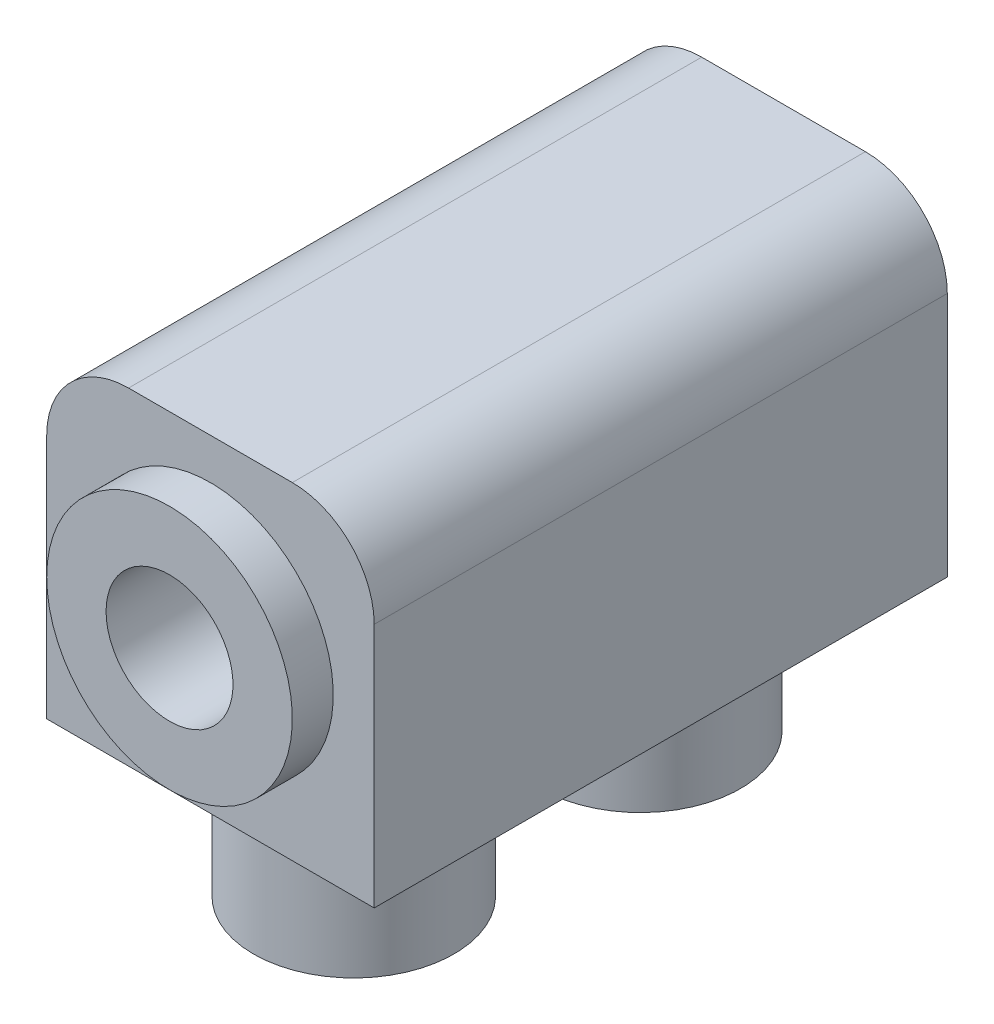
ISO-10303-21;
HEADER;
FILE_DESCRIPTION(('STEP AP214'),'2;1');
FILE_NAME('part.step','',(''),(''),'','','');
FILE_SCHEMA(('AUTOMOTIVE_DESIGN { 1 0 10303 214 1 1 1 1 }'));
ENDSEC;
DATA;
#1=APPLICATION_CONTEXT('core data for automotive mechanical design processes');
#2=APPLICATION_PROTOCOL_DEFINITION('international standard','automotive_design',2000,#1);
#3=PRODUCT_CONTEXT('',#1,'mechanical');
#4=PRODUCT('Part','Part','',(#3));
#5=PRODUCT_RELATED_PRODUCT_CATEGORY('part','',(#4));
#6=PRODUCT_DEFINITION_FORMATION('','',#4);
#7=PRODUCT_DEFINITION_CONTEXT('part definition',#1,'design');
#8=PRODUCT_DEFINITION('design','',#6,#7);
#9=PRODUCT_DEFINITION_SHAPE('','',#8);
#10=(LENGTH_UNIT() NAMED_UNIT(*) SI_UNIT(.MILLI.,.METRE.));
#11=(NAMED_UNIT(*) PLANE_ANGLE_UNIT() SI_UNIT($,.RADIAN.));
#12=(NAMED_UNIT(*) SI_UNIT($,.STERADIAN.) SOLID_ANGLE_UNIT());
#13=UNCERTAINTY_MEASURE_WITH_UNIT(LENGTH_MEASURE(1.E-05),#10,'distance_accuracy_value','');
#14=(GEOMETRIC_REPRESENTATION_CONTEXT(3) GLOBAL_UNCERTAINTY_ASSIGNED_CONTEXT((#13)) GLOBAL_UNIT_ASSIGNED_CONTEXT((#10,
#11,#12)) REPRESENTATION_CONTEXT('',''));
#15=CARTESIAN_POINT('',(0.,0.,0.));
#16=DIRECTION('',(0.,0.,1.));
#17=DIRECTION('',(1.,0.,0.));
#18=AXIS2_PLACEMENT_3D('',#15,#16,#17);
#19=CARTESIAN_POINT('',(0.,8.,0.));
#20=DIRECTION('',(1.,0.,0.));
#21=DIRECTION('',(0.,0.,-1.));
#22=AXIS2_PLACEMENT_3D('',#19,#20,#21);
#23=PLANE('',#22);
#24=DIRECTION('',(0.,-1.,0.));
#25=VECTOR('',#24,1.);
#26=CARTESIAN_POINT('',(0.,8.,0.));
#27=LINE('',#26,#25);
#28=CARTESIAN_POINT('',(0.,6.,0.));
#29=VERTEX_POINT('',#28);
#30=CARTESIAN_POINT('',(0.,0.,0.));
#31=VERTEX_POINT('',#30);
#32=EDGE_CURVE('E89',#29,#31,#27,.T.);
#33=ORIENTED_EDGE('',*,*,#32,.F.);
#34=DIRECTION('',(0.,0.,1.));
#35=VECTOR('',#34,1.);
#36=CARTESIAN_POINT('',(0.,6.,0.));
#37=LINE('',#36,#35);
#38=CARTESIAN_POINT('',(0.,6.,-14.));
#39=VERTEX_POINT('',#38);
#40=EDGE_CURVE('E40',#29,#39,#37,.F.);
#41=ORIENTED_EDGE('',*,*,#40,.T.);
#42=DIRECTION('',(0.,-1.,0.));
#43=VECTOR('',#42,1.);
#44=CARTESIAN_POINT('',(0.,8.,-14.));
#45=LINE('',#44,#43);
#46=CARTESIAN_POINT('',(0.,0.,-14.));
#47=VERTEX_POINT('',#46);
#48=EDGE_CURVE('E109',#39,#47,#45,.T.);
#49=ORIENTED_EDGE('',*,*,#48,.T.);
#50=DIRECTION('',(0.,0.,1.));
#51=VECTOR('',#50,1.);
#52=CARTESIAN_POINT('',(0.,0.,0.));
#53=LINE('',#52,#51);
#54=EDGE_CURVE('E104',#47,#31,#53,.T.);
#55=ORIENTED_EDGE('',*,*,#54,.T.);
#56=EDGE_LOOP('',(#33,#41,#49,#55));
#57=FACE_BOUND('',#56,.T.);
#58=ADVANCED_FACE('F36',(#57),#23,.F.);
#59=CARTESIAN_POINT('',(0.,8.,0.));
#60=DIRECTION('',(0.,0.,-1.));
#61=DIRECTION('',(-1.,0.,0.));
#62=AXIS2_PLACEMENT_3D('',#59,#60,#61);
#63=PLANE('',#62);
#64=CARTESIAN_POINT('',(4.,4.,0.));
#65=DIRECTION('',(0.,0.,-1.));
#66=DIRECTION('',(-1.,0.,0.));
#67=AXIS2_PLACEMENT_3D('',#64,#65,#66);
#68=CIRCLE('',#67,3.);
#69=CARTESIAN_POINT('',(1.,4.,0.));
#70=VERTEX_POINT('',#69);
#71=EDGE_CURVE('E164',#70,#70,#68,.T.);
#72=ORIENTED_EDGE('',*,*,#71,.T.);
#73=EDGE_LOOP('',(#72));
#74=FACE_BOUND('',#73,.T.);
#75=DIRECTION('',(0.,-1.,0.));
#76=VECTOR('',#75,1.);
#77=CARTESIAN_POINT('',(8.,8.,0.));
#78=LINE('',#77,#76);
#79=CARTESIAN_POINT('',(8.,6.,0.));
#80=VERTEX_POINT('',#79);
#81=CARTESIAN_POINT('',(8.,0.,0.));
#82=VERTEX_POINT('',#81);
#83=EDGE_CURVE('E98',#80,#82,#78,.T.);
#84=ORIENTED_EDGE('',*,*,#83,.F.);
#85=CARTESIAN_POINT('',(6.,6.,0.));
#86=DIRECTION('',(0.,0.,-1.));
#87=DIRECTION('',(-1.,0.,0.));
#88=AXIS2_PLACEMENT_3D('',#85,#86,#87);
#89=CIRCLE('',#88,2.);
#90=CARTESIAN_POINT('',(6.,8.,0.));
#91=VERTEX_POINT('',#90);
#92=EDGE_CURVE('E138',#80,#91,#89,.F.);
#93=ORIENTED_EDGE('',*,*,#92,.T.);
#94=DIRECTION('',(1.,0.,0.));
#95=VECTOR('',#94,1.);
#96=CARTESIAN_POINT('',(0.,8.,0.));
#97=LINE('',#96,#95);
#98=CARTESIAN_POINT('',(2.,8.,0.));
#99=VERTEX_POINT('',#98);
#100=EDGE_CURVE('E123',#99,#91,#97,.T.);
#101=ORIENTED_EDGE('',*,*,#100,.F.);
#102=CARTESIAN_POINT('',(2.,6.,0.));
#103=DIRECTION('',(0.,0.,-1.));
#104=DIRECTION('',(-1.,0.,0.));
#105=AXIS2_PLACEMENT_3D('',#102,#103,#104);
#106=CIRCLE('',#105,2.);
#107=EDGE_CURVE('E52',#99,#29,#106,.F.);
#108=ORIENTED_EDGE('',*,*,#107,.T.);
#109=ORIENTED_EDGE('',*,*,#32,.T.);
#110=DIRECTION('',(1.,0.,0.));
#111=VECTOR('',#110,1.);
#112=CARTESIAN_POINT('',(0.,0.,0.));
#113=LINE('',#112,#111);
#114=EDGE_CURVE('E92',#31,#82,#113,.T.);
#115=ORIENTED_EDGE('',*,*,#114,.T.);
#116=EDGE_LOOP('',(#84,#93,#101,#108,#109,#115));
#117=FACE_BOUND('',#116,.T.);
#118=ADVANCED_FACE('F91',(#74,#117),#63,.F.);
#119=CARTESIAN_POINT('',(8.,8.,0.));
#120=DIRECTION('',(-1.,0.,0.));
#121=DIRECTION('',(0.,0.,1.));
#122=AXIS2_PLACEMENT_3D('',#119,#120,#121);
#123=PLANE('',#122);
#124=DIRECTION('',(0.,-1.,0.));
#125=VECTOR('',#124,1.);
#126=CARTESIAN_POINT('',(8.,8.,-14.));
#127=LINE('',#126,#125);
#128=CARTESIAN_POINT('',(8.,6.,-14.));
#129=VERTEX_POINT('',#128);
#130=CARTESIAN_POINT('',(8.,0.,-14.));
#131=VERTEX_POINT('',#130);
#132=EDGE_CURVE('E125',#129,#131,#127,.T.);
#133=ORIENTED_EDGE('',*,*,#132,.F.);
#134=DIRECTION('',(0.,0.,-1.));
#135=VECTOR('',#134,1.);
#136=CARTESIAN_POINT('',(8.,6.,0.));
#137=LINE('',#136,#135);
#138=EDGE_CURVE('E60',#129,#80,#137,.F.);
#139=ORIENTED_EDGE('',*,*,#138,.T.);
#140=ORIENTED_EDGE('',*,*,#83,.T.);
#141=DIRECTION('',(0.,0.,-1.));
#142=VECTOR('',#141,1.);
#143=CARTESIAN_POINT('',(8.,0.,0.));
#144=LINE('',#143,#142);
#145=EDGE_CURVE('E106',#82,#131,#144,.T.);
#146=ORIENTED_EDGE('',*,*,#145,.T.);
#147=EDGE_LOOP('',(#133,#139,#140,#146));
#148=FACE_BOUND('',#147,.T.);
#149=ADVANCED_FACE('F199',(#148),#123,.F.);
#150=CARTESIAN_POINT('',(0.,8.,-14.));
#151=DIRECTION('',(0.,0.,1.));
#152=DIRECTION('',(1.,0.,0.));
#153=AXIS2_PLACEMENT_3D('',#150,#151,#152);
#154=PLANE('',#153);
#155=CARTESIAN_POINT('',(4.,4.,-14.));
#156=DIRECTION('',(0.,0.,-1.));
#157=DIRECTION('',(-1.,0.,0.));
#158=AXIS2_PLACEMENT_3D('',#155,#156,#157);
#159=CIRCLE('',#158,3.);
#160=CARTESIAN_POINT('',(1.,4.,-14.));
#161=VERTEX_POINT('',#160);
#162=EDGE_CURVE('E11',#161,#161,#159,.T.);
#163=ORIENTED_EDGE('',*,*,#162,.F.);
#164=EDGE_LOOP('',(#163));
#165=FACE_BOUND('',#164,.T.);
#166=DIRECTION('',(-1.,0.,0.));
#167=VECTOR('',#166,1.);
#168=CARTESIAN_POINT('',(0.,8.,-14.));
#169=LINE('',#168,#167);
#170=CARTESIAN_POINT('',(6.,8.,-14.));
#171=VERTEX_POINT('',#170);
#172=CARTESIAN_POINT('',(2.,8.,-14.));
#173=VERTEX_POINT('',#172);
#174=EDGE_CURVE('E117',#171,#173,#169,.T.);
#175=ORIENTED_EDGE('',*,*,#174,.F.);
#176=CARTESIAN_POINT('',(6.,6.,-14.));
#177=DIRECTION('',(0.,0.,1.));
#178=DIRECTION('',(1.,0.,0.));
#179=AXIS2_PLACEMENT_3D('',#176,#177,#178);
#180=CIRCLE('',#179,2.);
#181=EDGE_CURVE('E135',#171,#129,#180,.F.);
#182=ORIENTED_EDGE('',*,*,#181,.T.);
#183=ORIENTED_EDGE('',*,*,#132,.T.);
#184=DIRECTION('',(-1.,0.,0.));
#185=VECTOR('',#184,1.);
#186=CARTESIAN_POINT('',(0.,0.,-14.));
#187=LINE('',#186,#185);
#188=EDGE_CURVE('E121',#131,#47,#187,.T.);
#189=ORIENTED_EDGE('',*,*,#188,.T.);
#190=ORIENTED_EDGE('',*,*,#48,.F.);
#191=CARTESIAN_POINT('',(2.,6.,-14.));
#192=DIRECTION('',(0.,0.,1.));
#193=DIRECTION('',(1.,0.,0.));
#194=AXIS2_PLACEMENT_3D('',#191,#192,#193);
#195=CIRCLE('',#194,2.);
#196=EDGE_CURVE('E133',#39,#173,#195,.F.);
#197=ORIENTED_EDGE('',*,*,#196,.T.);
#198=EDGE_LOOP('',(#175,#182,#183,#189,#190,#197));
#199=FACE_BOUND('',#198,.T.);
#200=ADVANCED_FACE('F145',(#165,#199),#154,.F.);
#201=CARTESIAN_POINT('',(0.,8.,0.));
#202=DIRECTION('',(0.,-1.,0.));
#203=DIRECTION('',(0.,0.,-1.));
#204=AXIS2_PLACEMENT_3D('',#201,#202,#203);
#205=PLANE('',#204);
#206=ORIENTED_EDGE('',*,*,#100,.T.);
#207=DIRECTION('',(0.,0.,-1.));
#208=VECTOR('',#207,1.);
#209=CARTESIAN_POINT('',(6.,8.,0.));
#210=LINE('',#209,#208);
#211=EDGE_CURVE('E130',#91,#171,#210,.T.);
#212=ORIENTED_EDGE('',*,*,#211,.T.);
#213=ORIENTED_EDGE('',*,*,#174,.T.);
#214=DIRECTION('',(0.,0.,1.));
#215=VECTOR('',#214,1.);
#216=CARTESIAN_POINT('',(2.,8.,0.));
#217=LINE('',#216,#215);
#218=EDGE_CURVE('E97',#173,#99,#217,.T.);
#219=ORIENTED_EDGE('',*,*,#218,.T.);
#220=EDGE_LOOP('',(#206,#212,#213,#219));
#221=FACE_BOUND('',#220,.T.);
#222=ADVANCED_FACE('F149',(#221),#205,.F.);
#223=CARTESIAN_POINT('',(0.,0.,0.));
#224=DIRECTION('',(0.,-1.,0.));
#225=DIRECTION('',(0.,0.,-1.));
#226=AXIS2_PLACEMENT_3D('',#223,#224,#225);
#227=PLANE('',#226);
#228=CARTESIAN_POINT('',(4.,0.,-10.5));
#229=DIRECTION('',(0.,-1.,0.));
#230=DIRECTION('',(0.,0.,-1.));
#231=AXIS2_PLACEMENT_3D('',#228,#229,#230);
#232=CIRCLE('',#231,2.45);
#233=CARTESIAN_POINT('',(4.,0.,-12.95));
#234=VERTEX_POINT('',#233);
#235=EDGE_CURVE('E155',#234,#234,#232,.T.);
#236=ORIENTED_EDGE('',*,*,#235,.F.);
#237=EDGE_LOOP('',(#236));
#238=FACE_BOUND('',#237,.T.);
#239=CARTESIAN_POINT('',(4.,0.,-3.5));
#240=DIRECTION('',(0.,-1.,0.));
#241=DIRECTION('',(0.,0.,1.));
#242=AXIS2_PLACEMENT_3D('',#239,#240,#241);
#243=CIRCLE('',#242,2.45);
#244=CARTESIAN_POINT('',(4.,0.,-1.05));
#245=VERTEX_POINT('',#244);
#246=EDGE_CURVE('E114',#245,#245,#243,.T.);
#247=ORIENTED_EDGE('',*,*,#246,.F.);
#248=EDGE_LOOP('',(#247));
#249=FACE_BOUND('',#248,.T.);
#250=ORIENTED_EDGE('',*,*,#54,.F.);
#251=ORIENTED_EDGE('',*,*,#188,.F.);
#252=ORIENTED_EDGE('',*,*,#145,.F.);
#253=ORIENTED_EDGE('',*,*,#114,.F.);
#254=EDGE_LOOP('',(#250,#251,#252,#253));
#255=FACE_BOUND('',#254,.T.);
#256=ADVANCED_FACE('F102',(#238,#249,#255),#227,.T.);
#257=CARTESIAN_POINT('',(4.,-3.5,-3.5));
#258=DIRECTION('',(0.,1.,0.));
#259=DIRECTION('',(0.,0.,1.));
#260=AXIS2_PLACEMENT_3D('',#257,#258,#259);
#261=CYLINDRICAL_SURFACE('',#260,2.45);
#262=CARTESIAN_POINT('',(4.,-3.5,-3.5));
#263=DIRECTION('',(0.,-1.,0.));
#264=DIRECTION('',(0.,0.,1.));
#265=AXIS2_PLACEMENT_3D('',#262,#263,#264);
#266=CIRCLE('',#265,2.45);
#267=CARTESIAN_POINT('',(4.,-3.5,-1.05));
#268=VERTEX_POINT('',#267);
#269=EDGE_CURVE('E111',#268,#268,#266,.T.);
#270=ORIENTED_EDGE('',*,*,#269,.F.);
#271=EDGE_LOOP('',(#270));
#272=FACE_BOUND('',#271,.T.);
#273=ORIENTED_EDGE('',*,*,#246,.T.);
#274=EDGE_LOOP('',(#273));
#275=FACE_BOUND('',#274,.T.);
#276=ADVANCED_FACE('F235',(#272,#275),#261,.T.);
#277=CARTESIAN_POINT('',(4.,-3.5,-3.5));
#278=DIRECTION('',(0.,1.,0.));
#279=DIRECTION('',(0.,0.,1.));
#280=AXIS2_PLACEMENT_3D('',#277,#278,#279);
#281=PLANE('',#280);
#282=ORIENTED_EDGE('',*,*,#269,.T.);
#283=EDGE_LOOP('',(#282));
#284=FACE_BOUND('',#283,.T.);
#285=ADVANCED_FACE('F229',(#284),#281,.F.);
#286=CARTESIAN_POINT('',(4.,-3.5,-10.5));
#287=DIRECTION('',(0.,1.,0.));
#288=DIRECTION('',(0.,0.,1.));
#289=AXIS2_PLACEMENT_3D('',#286,#287,#288);
#290=CYLINDRICAL_SURFACE('',#289,2.45);
#291=CARTESIAN_POINT('',(4.,-3.5,-10.5));
#292=DIRECTION('',(0.,-1.,0.));
#293=DIRECTION('',(0.,0.,-1.));
#294=AXIS2_PLACEMENT_3D('',#291,#292,#293);
#295=CIRCLE('',#294,2.45);
#296=CARTESIAN_POINT('',(4.,-3.5,-12.95));
#297=VERTEX_POINT('',#296);
#298=EDGE_CURVE('E153',#297,#297,#295,.T.);
#299=ORIENTED_EDGE('',*,*,#298,.F.);
#300=EDGE_LOOP('',(#299));
#301=FACE_BOUND('',#300,.T.);
#302=ORIENTED_EDGE('',*,*,#235,.T.);
#303=EDGE_LOOP('',(#302));
#304=FACE_BOUND('',#303,.T.);
#305=ADVANCED_FACE('F223',(#301,#304),#290,.T.);
#306=CARTESIAN_POINT('',(4.,-3.5,-10.5));
#307=DIRECTION('',(0.,-1.,0.));
#308=DIRECTION('',(0.,0.,-1.));
#309=AXIS2_PLACEMENT_3D('',#306,#307,#308);
#310=PLANE('',#309);
#311=ORIENTED_EDGE('',*,*,#298,.T.);
#312=EDGE_LOOP('',(#311));
#313=FACE_BOUND('',#312,.T.);
#314=ADVANCED_FACE('F217',(#313),#310,.T.);
#315=CARTESIAN_POINT('',(6.,6.,0.));
#316=DIRECTION('',(0.,0.,-1.));
#317=DIRECTION('',(-1.,0.,0.));
#318=AXIS2_PLACEMENT_3D('',#315,#316,#317);
#319=CYLINDRICAL_SURFACE('',#318,2.);
#320=ORIENTED_EDGE('',*,*,#92,.F.);
#321=ORIENTED_EDGE('',*,*,#138,.F.);
#322=ORIENTED_EDGE('',*,*,#181,.F.);
#323=ORIENTED_EDGE('',*,*,#211,.F.);
#324=EDGE_LOOP('',(#320,#321,#322,#323));
#325=FACE_BOUND('',#324,.T.);
#326=ADVANCED_FACE('F215',(#325),#319,.T.);
#327=CARTESIAN_POINT('',(2.,6.,0.));
#328=DIRECTION('',(0.,0.,1.));
#329=DIRECTION('',(1.,0.,0.));
#330=AXIS2_PLACEMENT_3D('',#327,#328,#329);
#331=CYLINDRICAL_SURFACE('',#330,2.);
#332=ORIENTED_EDGE('',*,*,#196,.F.);
#333=ORIENTED_EDGE('',*,*,#40,.F.);
#334=ORIENTED_EDGE('',*,*,#107,.F.);
#335=ORIENTED_EDGE('',*,*,#218,.F.);
#336=EDGE_LOOP('',(#332,#333,#334,#335));
#337=FACE_BOUND('',#336,.T.);
#338=ADVANCED_FACE('F38',(#337),#331,.T.);
#339=CARTESIAN_POINT('',(4.,4.,-15.));
#340=DIRECTION('',(0.,0.,1.));
#341=DIRECTION('',(1.,0.,0.));
#342=AXIS2_PLACEMENT_3D('',#339,#340,#341);
#343=CYLINDRICAL_SURFACE('',#342,3.);
#344=CARTESIAN_POINT('',(4.,4.,-15.));
#345=DIRECTION('',(0.,0.,-1.));
#346=DIRECTION('',(-1.,0.,0.));
#347=AXIS2_PLACEMENT_3D('',#344,#345,#346);
#348=CIRCLE('',#347,3.);
#349=CARTESIAN_POINT('',(1.,4.,-15.));
#350=VERTEX_POINT('',#349);
#351=EDGE_CURVE('E158',#350,#350,#348,.T.);
#352=ORIENTED_EDGE('',*,*,#351,.F.);
#353=EDGE_LOOP('',(#352));
#354=FACE_BOUND('',#353,.T.);
#355=ORIENTED_EDGE('',*,*,#162,.T.);
#356=EDGE_LOOP('',(#355));
#357=FACE_BOUND('',#356,.T.);
#358=ADVANCED_FACE('F189',(#354,#357),#343,.T.);
#359=CARTESIAN_POINT('',(4.,4.,-15.));
#360=DIRECTION('',(0.,0.,-1.));
#361=DIRECTION('',(-1.,0.,0.));
#362=AXIS2_PLACEMENT_3D('',#359,#360,#361);
#363=PLANE('',#362);
#364=CARTESIAN_POINT('',(4.,4.,-15.));
#365=DIRECTION('',(0.,0.,-1.));
#366=DIRECTION('',(-1.,0.,0.));
#367=AXIS2_PLACEMENT_3D('',#364,#365,#366);
#368=CIRCLE('',#367,1.55);
#369=CARTESIAN_POINT('',(2.45,4.,-15.));
#370=VERTEX_POINT('',#369);
#371=EDGE_CURVE('E170',#370,#370,#368,.T.);
#372=ORIENTED_EDGE('',*,*,#371,.F.);
#373=EDGE_LOOP('',(#372));
#374=FACE_BOUND('',#373,.T.);
#375=ORIENTED_EDGE('',*,*,#351,.T.);
#376=EDGE_LOOP('',(#375));
#377=FACE_BOUND('',#376,.T.);
#378=ADVANCED_FACE('F185',(#374,#377),#363,.T.);
#379=CARTESIAN_POINT('',(4.,4.,1.));
#380=DIRECTION('',(0.,0.,-1.));
#381=DIRECTION('',(-1.,0.,0.));
#382=AXIS2_PLACEMENT_3D('',#379,#380,#381);
#383=CYLINDRICAL_SURFACE('',#382,3.);
#384=CARTESIAN_POINT('',(4.,4.,1.));
#385=DIRECTION('',(0.,0.,-1.));
#386=DIRECTION('',(-1.,0.,0.));
#387=AXIS2_PLACEMENT_3D('',#384,#385,#386);
#388=CIRCLE('',#387,3.);
#389=CARTESIAN_POINT('',(1.,4.,1.));
#390=VERTEX_POINT('',#389);
#391=EDGE_CURVE('E163',#390,#390,#388,.T.);
#392=ORIENTED_EDGE('',*,*,#391,.T.);
#393=EDGE_LOOP('',(#392));
#394=FACE_BOUND('',#393,.T.);
#395=ORIENTED_EDGE('',*,*,#71,.F.);
#396=EDGE_LOOP('',(#395));
#397=FACE_BOUND('',#396,.T.);
#398=ADVANCED_FACE('F188',(#394,#397),#383,.T.);
#399=CARTESIAN_POINT('',(4.,4.,1.));
#400=DIRECTION('',(0.,0.,1.));
#401=DIRECTION('',(-1.,0.,0.));
#402=AXIS2_PLACEMENT_3D('',#399,#400,#401);
#403=PLANE('',#402);
#404=CARTESIAN_POINT('',(4.,4.,1.));
#405=DIRECTION('',(0.,0.,-1.));
#406=DIRECTION('',(-1.,0.,0.));
#407=AXIS2_PLACEMENT_3D('',#404,#405,#406);
#408=CIRCLE('',#407,1.55);
#409=CARTESIAN_POINT('',(2.45,4.,1.));
#410=VERTEX_POINT('',#409);
#411=EDGE_CURVE('E167',#410,#410,#408,.T.);
#412=ORIENTED_EDGE('',*,*,#411,.T.);
#413=EDGE_LOOP('',(#412));
#414=FACE_BOUND('',#413,.T.);
#415=ORIENTED_EDGE('',*,*,#391,.F.);
#416=EDGE_LOOP('',(#415));
#417=FACE_BOUND('',#416,.T.);
#418=ADVANCED_FACE('F176',(#414,#417),#403,.T.);
#419=CARTESIAN_POINT('',(4.,4.,1.));
#420=DIRECTION('',(0.,0.,-1.));
#421=DIRECTION('',(-1.,0.,0.));
#422=AXIS2_PLACEMENT_3D('',#419,#420,#421);
#423=CYLINDRICAL_SURFACE('',#422,1.55);
#424=ORIENTED_EDGE('',*,*,#411,.F.);
#425=EDGE_LOOP('',(#424));
#426=FACE_BOUND('',#425,.T.);
#427=ORIENTED_EDGE('',*,*,#371,.T.);
#428=EDGE_LOOP('',(#427));
#429=FACE_BOUND('',#428,.T.);
#430=ADVANCED_FACE('F179',(#426,#429),#423,.F.);
#431=CLOSED_SHELL('',(#58,#118,#149,#200,#222,#256,#276,#285,#305,#314,#326,#338,#358,#378,#398,
#418,#430));
#432=MANIFOLD_SOLID_BREP('B2',#431);
#433=ADVANCED_BREP_SHAPE_REPRESENTATION('',(#18,#432),#14);
#434=SHAPE_DEFINITION_REPRESENTATION(#9,#433);
ENDSEC;
END-ISO-10303-21;
